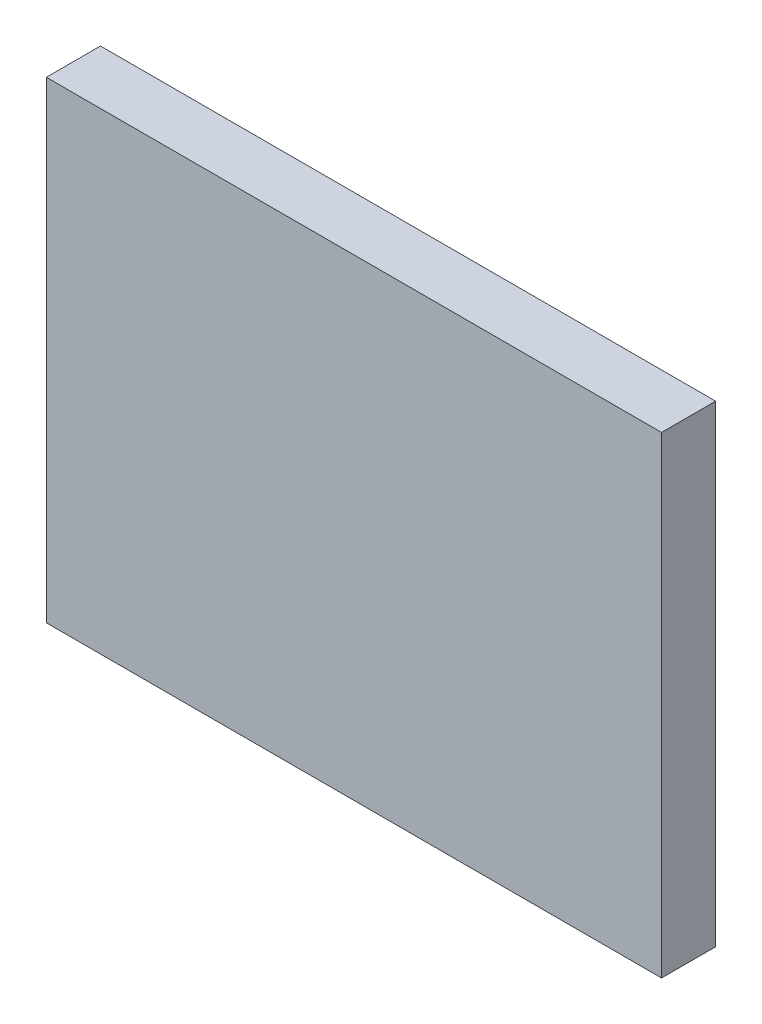
ISO-10303-21;
HEADER;
FILE_DESCRIPTION(('STEP AP214'),'2;1');
FILE_NAME('part.step','',(''),(''),'','','');
FILE_SCHEMA(('AUTOMOTIVE_DESIGN { 1 0 10303 214 1 1 1 1 }'));
ENDSEC;
DATA;
#1=APPLICATION_CONTEXT('core data for automotive mechanical design processes');
#2=APPLICATION_PROTOCOL_DEFINITION('international standard','automotive_design',2000,#1);
#3=PRODUCT_CONTEXT('',#1,'mechanical');
#4=PRODUCT('Part','Part','',(#3));
#5=PRODUCT_RELATED_PRODUCT_CATEGORY('part','',(#4));
#6=PRODUCT_DEFINITION_FORMATION('','',#4);
#7=PRODUCT_DEFINITION_CONTEXT('part definition',#1,'design');
#8=PRODUCT_DEFINITION('design','',#6,#7);
#9=PRODUCT_DEFINITION_SHAPE('','',#8);
#10=(LENGTH_UNIT() NAMED_UNIT(*) SI_UNIT(.MILLI.,.METRE.));
#11=(NAMED_UNIT(*) PLANE_ANGLE_UNIT() SI_UNIT($,.RADIAN.));
#12=(NAMED_UNIT(*) SI_UNIT($,.STERADIAN.) SOLID_ANGLE_UNIT());
#13=UNCERTAINTY_MEASURE_WITH_UNIT(LENGTH_MEASURE(1.E-05),#10,'distance_accuracy_value','');
#14=(GEOMETRIC_REPRESENTATION_CONTEXT(3) GLOBAL_UNCERTAINTY_ASSIGNED_CONTEXT((#13)) GLOBAL_UNIT_ASSIGNED_CONTEXT((#10,
#11,#12)) REPRESENTATION_CONTEXT('',''));
#15=CARTESIAN_POINT('',(0.,0.,0.));
#16=DIRECTION('',(0.,0.,1.));
#17=DIRECTION('',(1.,0.,0.));
#18=AXIS2_PLACEMENT_3D('',#15,#16,#17);
#19=CARTESIAN_POINT('',(6.46403826108748,0.614093810952887,1.6));
#20=DIRECTION('',(0.,0.,1.));
#21=DIRECTION('',(1.,0.,0.));
#22=AXIS2_PLACEMENT_3D('',#19,#20,#21);
#23=PLANE('',#22);
#24=DIRECTION('',(0.,-1.,0.));
#25=VECTOR('',#24,1.);
#26=CARTESIAN_POINT('',(31.4640382610875,19.8140938109529,1.6));
#27=LINE('',#26,#25);
#28=CARTESIAN_POINT('',(31.4640382610875,19.8140938109529,1.6));
#29=VERTEX_POINT('',#28);
#30=CARTESIAN_POINT('',(31.4640382610875,-18.5859061890471,1.6));
#31=VERTEX_POINT('',#30);
#32=EDGE_CURVE('E27',#29,#31,#27,.T.);
#33=ORIENTED_EDGE('',*,*,#32,.T.);
#34=DIRECTION('',(-1.,0.,0.));
#35=VECTOR('',#34,1.);
#36=CARTESIAN_POINT('',(31.4640382610875,-18.5859061890471,1.6));
#37=LINE('',#36,#35);
#38=CARTESIAN_POINT('',(-18.5359617389125,-18.5859061890471,1.6));
#39=VERTEX_POINT('',#38);
#40=EDGE_CURVE('E20',#31,#39,#37,.T.);
#41=ORIENTED_EDGE('',*,*,#40,.T.);
#42=DIRECTION('',(0.,1.,0.));
#43=VECTOR('',#42,1.);
#44=CARTESIAN_POINT('',(-18.5359617389125,-18.5859061890471,1.6));
#45=LINE('',#44,#43);
#46=CARTESIAN_POINT('',(-18.5359617389125,19.8140938109529,1.6));
#47=VERTEX_POINT('',#46);
#48=EDGE_CURVE('E77',#39,#47,#45,.T.);
#49=ORIENTED_EDGE('',*,*,#48,.T.);
#50=DIRECTION('',(1.,0.,0.));
#51=VECTOR('',#50,1.);
#52=CARTESIAN_POINT('',(-18.5359617389125,19.8140938109529,1.6));
#53=LINE('',#52,#51);
#54=EDGE_CURVE('E55',#47,#29,#53,.T.);
#55=ORIENTED_EDGE('',*,*,#54,.T.);
#56=EDGE_LOOP('',(#33,#41,#49,#55));
#57=FACE_BOUND('',#56,.T.);
#58=ADVANCED_FACE('F16',(#57),#23,.F.);
#59=CARTESIAN_POINT('',(6.46403826108748,0.614093810952887,6.));
#60=DIRECTION('',(0.,0.,1.));
#61=DIRECTION('',(1.,0.,0.));
#62=AXIS2_PLACEMENT_3D('',#59,#60,#61);
#63=PLANE('',#62);
#64=DIRECTION('',(0.,1.,0.));
#65=VECTOR('',#64,1.);
#66=CARTESIAN_POINT('',(31.4640382610875,19.8140938109529,6.));
#67=LINE('',#66,#65);
#68=CARTESIAN_POINT('',(31.4640382610875,-18.5859061890471,6.));
#69=VERTEX_POINT('',#68);
#70=CARTESIAN_POINT('',(31.4640382610875,19.8140938109529,6.));
#71=VERTEX_POINT('',#70);
#72=EDGE_CURVE('E11',#69,#71,#67,.T.);
#73=ORIENTED_EDGE('',*,*,#72,.T.);
#74=DIRECTION('',(-1.,0.,0.));
#75=VECTOR('',#74,1.);
#76=CARTESIAN_POINT('',(-18.5359617389125,19.8140938109529,6.));
#77=LINE('',#76,#75);
#78=CARTESIAN_POINT('',(-18.5359617389125,19.8140938109529,6.));
#79=VERTEX_POINT('',#78);
#80=EDGE_CURVE('E141',#71,#79,#77,.T.);
#81=ORIENTED_EDGE('',*,*,#80,.T.);
#82=DIRECTION('',(0.,-1.,0.));
#83=VECTOR('',#82,1.);
#84=CARTESIAN_POINT('',(-18.5359617389125,-18.5859061890471,6.));
#85=LINE('',#84,#83);
#86=CARTESIAN_POINT('',(-18.5359617389125,-18.5859061890471,6.));
#87=VERTEX_POINT('',#86);
#88=EDGE_CURVE('E63',#79,#87,#85,.T.);
#89=ORIENTED_EDGE('',*,*,#88,.T.);
#90=DIRECTION('',(1.,0.,0.));
#91=VECTOR('',#90,1.);
#92=CARTESIAN_POINT('',(31.4640382610875,-18.5859061890471,6.));
#93=LINE('',#92,#91);
#94=EDGE_CURVE('E94',#87,#69,#93,.T.);
#95=ORIENTED_EDGE('',*,*,#94,.T.);
#96=EDGE_LOOP('',(#73,#81,#89,#95));
#97=FACE_BOUND('',#96,.T.);
#98=ADVANCED_FACE('F188',(#97),#63,.T.);
#99=CARTESIAN_POINT('',(31.4640382610875,-18.5859061890471,1.6));
#100=DIRECTION('',(1.,0.,0.));
#101=DIRECTION('',(0.,1.,0.));
#102=AXIS2_PLACEMENT_3D('',#99,#100,#101);
#103=PLANE('',#102);
#104=ORIENTED_EDGE('',*,*,#32,.F.);
#105=DIRECTION('',(0.,0.,1.));
#106=VECTOR('',#105,1.);
#107=CARTESIAN_POINT('',(31.4640382610875,19.8140938109529,1.6));
#108=LINE('',#107,#106);
#109=EDGE_CURVE('E87',#29,#71,#108,.T.);
#110=ORIENTED_EDGE('',*,*,#109,.T.);
#111=ORIENTED_EDGE('',*,*,#72,.F.);
#112=DIRECTION('',(0.,0.,1.));
#113=VECTOR('',#112,1.);
#114=CARTESIAN_POINT('',(31.4640382610875,-18.5859061890471,1.6));
#115=LINE('',#114,#113);
#116=EDGE_CURVE('E89',#31,#69,#115,.T.);
#117=ORIENTED_EDGE('',*,*,#116,.F.);
#118=EDGE_LOOP('',(#104,#110,#111,#117));
#119=FACE_BOUND('',#118,.T.);
#120=ADVANCED_FACE('F90',(#119),#103,.T.);
#121=CARTESIAN_POINT('',(31.4640382610875,19.8140938109529,1.6));
#122=DIRECTION('',(0.,1.,0.));
#123=DIRECTION('',(1.,0.,0.));
#124=AXIS2_PLACEMENT_3D('',#121,#122,#123);
#125=PLANE('',#124);
#126=ORIENTED_EDGE('',*,*,#54,.F.);
#127=DIRECTION('',(0.,0.,1.));
#128=VECTOR('',#127,1.);
#129=CARTESIAN_POINT('',(-18.5359617389125,19.8140938109529,1.6));
#130=LINE('',#129,#128);
#131=EDGE_CURVE('E131',#47,#79,#130,.T.);
#132=ORIENTED_EDGE('',*,*,#131,.T.);
#133=ORIENTED_EDGE('',*,*,#80,.F.);
#134=ORIENTED_EDGE('',*,*,#109,.F.);
#135=EDGE_LOOP('',(#126,#132,#133,#134));
#136=FACE_BOUND('',#135,.T.);
#137=ADVANCED_FACE('F173',(#136),#125,.T.);
#138=CARTESIAN_POINT('',(-18.5359617389125,19.8140938109529,1.6));
#139=DIRECTION('',(-1.,0.,0.));
#140=DIRECTION('',(0.,0.,1.));
#141=AXIS2_PLACEMENT_3D('',#138,#139,#140);
#142=PLANE('',#141);
#143=ORIENTED_EDGE('',*,*,#48,.F.);
#144=DIRECTION('',(0.,0.,1.));
#145=VECTOR('',#144,1.);
#146=CARTESIAN_POINT('',(-18.5359617389125,-18.5859061890471,1.6));
#147=LINE('',#146,#145);
#148=EDGE_CURVE('E97',#39,#87,#147,.T.);
#149=ORIENTED_EDGE('',*,*,#148,.T.);
#150=ORIENTED_EDGE('',*,*,#88,.F.);
#151=ORIENTED_EDGE('',*,*,#131,.F.);
#152=EDGE_LOOP('',(#143,#149,#150,#151));
#153=FACE_BOUND('',#152,.T.);
#154=ADVANCED_FACE('F18',(#153),#142,.T.);
#155=CARTESIAN_POINT('',(-18.5359617389125,-18.5859061890471,1.6));
#156=DIRECTION('',(0.,-1.,0.));
#157=DIRECTION('',(0.,0.,-1.));
#158=AXIS2_PLACEMENT_3D('',#155,#156,#157);
#159=PLANE('',#158);
#160=ORIENTED_EDGE('',*,*,#40,.F.);
#161=ORIENTED_EDGE('',*,*,#116,.T.);
#162=ORIENTED_EDGE('',*,*,#94,.F.);
#163=ORIENTED_EDGE('',*,*,#148,.F.);
#164=EDGE_LOOP('',(#160,#161,#162,#163));
#165=FACE_BOUND('',#164,.T.);
#166=ADVANCED_FACE('F96',(#165),#159,.T.);
#167=CLOSED_SHELL('',(#58,#98,#120,#137,#154,#166));
#168=MANIFOLD_SOLID_BREP('B1',#167);
#169=ADVANCED_BREP_SHAPE_REPRESENTATION('',(#18,#168),#14);
#170=SHAPE_DEFINITION_REPRESENTATION(#9,#169);
ENDSEC;
END-ISO-10303-21;
